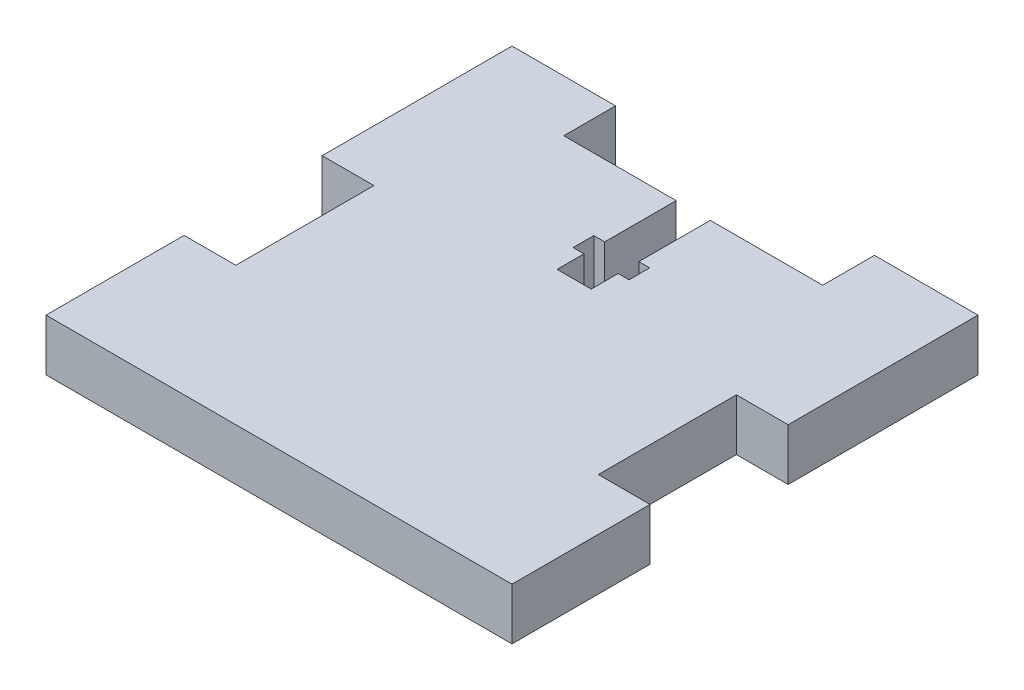
ISO-10303-21;
HEADER;
FILE_DESCRIPTION(('STEP AP214'),'2;1');
FILE_NAME('part.step','',(''),(''),'','','');
FILE_SCHEMA(('AUTOMOTIVE_DESIGN { 1 0 10303 214 1 1 1 1 }'));
ENDSEC;
DATA;
#1=APPLICATION_CONTEXT('core data for automotive mechanical design processes');
#2=APPLICATION_PROTOCOL_DEFINITION('international standard','automotive_design',2000,#1);
#3=PRODUCT_CONTEXT('',#1,'mechanical');
#4=PRODUCT('Part','Part','',(#3));
#5=PRODUCT_RELATED_PRODUCT_CATEGORY('part','',(#4));
#6=PRODUCT_DEFINITION_FORMATION('','',#4);
#7=PRODUCT_DEFINITION_CONTEXT('part definition',#1,'design');
#8=PRODUCT_DEFINITION('design','',#6,#7);
#9=PRODUCT_DEFINITION_SHAPE('','',#8);
#10=(LENGTH_UNIT() NAMED_UNIT(*) SI_UNIT(.MILLI.,.METRE.));
#11=(NAMED_UNIT(*) PLANE_ANGLE_UNIT() SI_UNIT($,.RADIAN.));
#12=(NAMED_UNIT(*) SI_UNIT($,.STERADIAN.) SOLID_ANGLE_UNIT());
#13=UNCERTAINTY_MEASURE_WITH_UNIT(LENGTH_MEASURE(1.E-05),#10,'distance_accuracy_value','');
#14=(GEOMETRIC_REPRESENTATION_CONTEXT(3) GLOBAL_UNCERTAINTY_ASSIGNED_CONTEXT((#13)) GLOBAL_UNIT_ASSIGNED_CONTEXT((#10,
#11,#12)) REPRESENTATION_CONTEXT('',''));
#15=CARTESIAN_POINT('',(0.,0.,0.));
#16=DIRECTION('',(0.,0.,1.));
#17=DIRECTION('',(1.,0.,0.));
#18=AXIS2_PLACEMENT_3D('',#15,#16,#17);
#19=CARTESIAN_POINT('',(0.,0.,0.));
#20=DIRECTION('',(0.,0.,1.));
#21=DIRECTION('',(1.,0.,0.));
#22=AXIS2_PLACEMENT_3D('',#19,#20,#21);
#23=PLANE('',#22);
#24=DIRECTION('',(1.,0.,0.));
#25=VECTOR('',#24,1.);
#26=CARTESIAN_POINT('',(-22.225,-20.6375,0.));
#27=LINE('',#26,#25);
#28=CARTESIAN_POINT('',(2.09549999999999,-20.6375,0.));
#29=VERTEX_POINT('',#28);
#30=CARTESIAN_POINT('',(15.875,-20.6375,0.));
#31=VERTEX_POINT('',#30);
#32=EDGE_CURVE('E373',#29,#31,#27,.T.);
#33=ORIENTED_EDGE('',*,*,#32,.F.);
#34=DIRECTION('',(0.,-1.,0.));
#35=VECTOR('',#34,1.);
#36=CARTESIAN_POINT('',(2.09549999999999,-14.28745,0.));
#37=LINE('',#36,#35);
#38=CARTESIAN_POINT('',(2.09549999999999,-14.2875,0.));
#39=VERTEX_POINT('',#38);
#40=EDGE_CURVE('E272',#39,#29,#37,.T.);
#41=ORIENTED_EDGE('',*,*,#40,.F.);
#42=DIRECTION('',(-1.,0.,0.));
#43=VECTOR('',#42,1.);
#44=CARTESIAN_POINT('',(-22.225,-14.2875,0.));
#45=LINE('',#44,#43);
#46=CARTESIAN_POINT('',(15.875,-14.2875,0.));
#47=VERTEX_POINT('',#46);
#48=EDGE_CURVE('E371',#47,#39,#45,.T.);
#49=ORIENTED_EDGE('',*,*,#48,.F.);
#50=DIRECTION('',(0.,1.,0.));
#51=VECTOR('',#50,1.);
#52=CARTESIAN_POINT('',(15.875,-20.6375,0.));
#53=LINE('',#52,#51);
#54=EDGE_CURVE('E322',#31,#47,#53,.T.);
#55=ORIENTED_EDGE('',*,*,#54,.F.);
#56=EDGE_LOOP('',(#33,#41,#49,#55));
#57=FACE_BOUND('',#56,.T.);
#58=ADVANCED_FACE('F35',(#57),#23,.F.);
#59=CARTESIAN_POINT('',(-2.09550000000001,-14.2875,0.));
#60=VERTEX_POINT('',#59);
#61=CARTESIAN_POINT('',(-15.875,-14.2875,0.));
#62=VERTEX_POINT('',#61);
#63=EDGE_CURVE('E39',#60,#62,#45,.T.);
#64=ORIENTED_EDGE('',*,*,#63,.F.);
#65=DIRECTION('',(0.,-1.,0.));
#66=VECTOR('',#65,1.);
#67=CARTESIAN_POINT('',(-2.09550000000001,-14.28745,0.));
#68=LINE('',#67,#66);
#69=CARTESIAN_POINT('',(-2.09550000000001,-20.6375,0.));
#70=VERTEX_POINT('',#69);
#71=EDGE_CURVE('E275',#60,#70,#68,.T.);
#72=ORIENTED_EDGE('',*,*,#71,.T.);
#73=CARTESIAN_POINT('',(-15.875,-20.6375,0.));
#74=VERTEX_POINT('',#73);
#75=EDGE_CURVE('E360',#74,#70,#27,.T.);
#76=ORIENTED_EDGE('',*,*,#75,.F.);
#77=DIRECTION('',(0.,-1.,0.));
#78=VECTOR('',#77,1.);
#79=CARTESIAN_POINT('',(-15.875,-20.6375,0.));
#80=LINE('',#79,#78);
#81=EDGE_CURVE('E340',#62,#74,#80,.T.);
#82=ORIENTED_EDGE('',*,*,#81,.F.);
#83=EDGE_LOOP('',(#64,#72,#76,#82));
#84=FACE_BOUND('',#83,.T.);
#85=ADVANCED_FACE('F498',(#84),#23,.F.);
#86=CARTESIAN_POINT('',(22.225,-14.2875,50.8));
#87=DIRECTION('',(-1.,0.,0.));
#88=DIRECTION('',(0.,0.,1.));
#89=AXIS2_PLACEMENT_3D('',#86,#87,#88);
#90=PLANE('',#89);
#91=DIRECTION('',(0.,-1.,0.));
#92=VECTOR('',#91,1.);
#93=CARTESIAN_POINT('',(22.225,-14.2875,16.9333333333333));
#94=LINE('',#93,#92);
#95=CARTESIAN_POINT('',(22.225,-14.2875,16.9333333333333));
#96=VERTEX_POINT('',#95);
#97=CARTESIAN_POINT('',(22.225,-20.6375,16.9333333333333));
#98=VERTEX_POINT('',#97);
#99=EDGE_CURVE('E406',#96,#98,#94,.T.);
#100=ORIENTED_EDGE('',*,*,#99,.F.);
#101=DIRECTION('',(0.,0.,-1.));
#102=VECTOR('',#101,1.);
#103=CARTESIAN_POINT('',(22.225,-14.2875,50.8));
#104=LINE('',#103,#102);
#105=CARTESIAN_POINT('',(22.225,-14.2875,33.8666666666667));
#106=VERTEX_POINT('',#105);
#107=EDGE_CURVE('E12',#106,#96,#104,.T.);
#108=ORIENTED_EDGE('',*,*,#107,.F.);
#109=DIRECTION('',(0.,1.,0.));
#110=VECTOR('',#109,1.);
#111=CARTESIAN_POINT('',(22.225,-14.2875,33.8666666666667));
#112=LINE('',#111,#110);
#113=CARTESIAN_POINT('',(22.225,-20.6375,33.8666666666667));
#114=VERTEX_POINT('',#113);
#115=EDGE_CURVE('E456',#114,#106,#112,.T.);
#116=ORIENTED_EDGE('',*,*,#115,.F.);
#117=DIRECTION('',(0.,0.,-1.));
#118=VECTOR('',#117,1.);
#119=CARTESIAN_POINT('',(22.225,-20.6375,50.8));
#120=LINE('',#119,#118);
#121=EDGE_CURVE('E381',#114,#98,#120,.T.);
#122=ORIENTED_EDGE('',*,*,#121,.T.);
#123=EDGE_LOOP('',(#100,#108,#116,#122));
#124=FACE_BOUND('',#123,.T.);
#125=ADVANCED_FACE('F37',(#124),#90,.F.);
#126=CARTESIAN_POINT('',(-22.225,-14.2875,50.8));
#127=DIRECTION('',(1.,0.,0.));
#128=DIRECTION('',(0.,0.,-1.));
#129=AXIS2_PLACEMENT_3D('',#126,#127,#128);
#130=PLANE('',#129);
#131=DIRECTION('',(0.,1.,0.));
#132=VECTOR('',#131,1.);
#133=CARTESIAN_POINT('',(-22.225,-14.2875,16.9333333333333));
#134=LINE('',#133,#132);
#135=CARTESIAN_POINT('',(-22.225,-20.6375,16.9333333333333));
#136=VERTEX_POINT('',#135);
#137=CARTESIAN_POINT('',(-22.225,-14.2875,16.9333333333333));
#138=VERTEX_POINT('',#137);
#139=EDGE_CURVE('E393',#136,#138,#134,.T.);
#140=ORIENTED_EDGE('',*,*,#139,.F.);
#141=DIRECTION('',(0.,0.,-1.));
#142=VECTOR('',#141,1.);
#143=CARTESIAN_POINT('',(-22.225,-20.6375,50.8));
#144=LINE('',#143,#142);
#145=CARTESIAN_POINT('',(-22.225,-20.6375,33.8666666666667));
#146=VERTEX_POINT('',#145);
#147=EDGE_CURVE('E384',#146,#136,#144,.T.);
#148=ORIENTED_EDGE('',*,*,#147,.F.);
#149=DIRECTION('',(0.,-1.,0.));
#150=VECTOR('',#149,1.);
#151=CARTESIAN_POINT('',(-22.225,-14.2875,33.8666666666667));
#152=LINE('',#151,#150);
#153=CARTESIAN_POINT('',(-22.225,-14.2875,33.8666666666667));
#154=VERTEX_POINT('',#153);
#155=EDGE_CURVE('E394',#154,#146,#152,.T.);
#156=ORIENTED_EDGE('',*,*,#155,.F.);
#157=DIRECTION('',(0.,0.,-1.));
#158=VECTOR('',#157,1.);
#159=CARTESIAN_POINT('',(-22.225,-14.2875,50.8));
#160=LINE('',#159,#158);
#161=EDGE_CURVE('E45',#154,#138,#160,.T.);
#162=ORIENTED_EDGE('',*,*,#161,.T.);
#163=EDGE_LOOP('',(#140,#148,#156,#162));
#164=FACE_BOUND('',#163,.T.);
#165=ADVANCED_FACE('F391',(#164),#130,.F.);
#166=CARTESIAN_POINT('',(-22.225,-14.2875,50.8));
#167=DIRECTION('',(0.,-1.,0.));
#168=DIRECTION('',(0.,0.,-1.));
#169=AXIS2_PLACEMENT_3D('',#166,#167,#168);
#170=PLANE('',#169);
#171=ORIENTED_EDGE('',*,*,#48,.T.);
#172=DIRECTION('',(0.,0.,1.));
#173=VECTOR('',#172,1.);
#174=CARTESIAN_POINT('',(2.09549999999998,-14.2875,50.8));
#175=LINE('',#174,#173);
#176=CARTESIAN_POINT('',(2.09549999999999,-14.2875,8.76299999999999));
#177=VERTEX_POINT('',#176);
#178=EDGE_CURVE('E319',#39,#177,#175,.T.);
#179=ORIENTED_EDGE('',*,*,#178,.T.);
#180=DIRECTION('',(1.,0.,0.));
#181=VECTOR('',#180,1.);
#182=CARTESIAN_POINT('',(-22.225,-14.2875,8.76299999999999));
#183=LINE('',#182,#181);
#184=CARTESIAN_POINT('',(3.42899999999999,-14.2875,8.76299999999999));
#185=VERTEX_POINT('',#184);
#186=EDGE_CURVE('E274',#177,#185,#183,.T.);
#187=ORIENTED_EDGE('',*,*,#186,.T.);
#188=DIRECTION('',(0.,0.,1.));
#189=VECTOR('',#188,1.);
#190=CARTESIAN_POINT('',(3.42899999999999,-14.2875,50.8));
#191=LINE('',#190,#189);
#192=CARTESIAN_POINT('',(3.42899999999999,-14.2875,11.303));
#193=VERTEX_POINT('',#192);
#194=EDGE_CURVE('E233',#185,#193,#191,.T.);
#195=ORIENTED_EDGE('',*,*,#194,.T.);
#196=DIRECTION('',(-1.,0.,0.));
#197=VECTOR('',#196,1.);
#198=CARTESIAN_POINT('',(-22.225,-14.2875,11.303));
#199=LINE('',#198,#197);
#200=CARTESIAN_POINT('',(2.09549999999999,-14.2875,11.303));
#201=VERTEX_POINT('',#200);
#202=EDGE_CURVE('E296',#193,#201,#199,.T.);
#203=ORIENTED_EDGE('',*,*,#202,.T.);
#204=DIRECTION('',(0.,0.,1.));
#205=VECTOR('',#204,1.);
#206=CARTESIAN_POINT('',(2.09549999999999,-14.2875,50.8));
#207=LINE('',#206,#205);
#208=CARTESIAN_POINT('',(2.09549999999999,-14.2875,14.605));
#209=VERTEX_POINT('',#208);
#210=EDGE_CURVE('E299',#201,#209,#207,.T.);
#211=ORIENTED_EDGE('',*,*,#210,.T.);
#212=DIRECTION('',(-1.,0.,0.));
#213=VECTOR('',#212,1.);
#214=CARTESIAN_POINT('',(-22.225,-14.2875,14.605));
#215=LINE('',#214,#213);
#216=CARTESIAN_POINT('',(-2.09550000000001,-14.2875,14.605));
#217=VERTEX_POINT('',#216);
#218=EDGE_CURVE('E302',#209,#217,#215,.T.);
#219=ORIENTED_EDGE('',*,*,#218,.T.);
#220=DIRECTION('',(0.,0.,-1.));
#221=VECTOR('',#220,1.);
#222=CARTESIAN_POINT('',(-2.09550000000002,-14.2875,50.8));
#223=LINE('',#222,#221);
#224=CARTESIAN_POINT('',(-2.09550000000001,-14.2875,11.303));
#225=VERTEX_POINT('',#224);
#226=EDGE_CURVE('E305',#217,#225,#223,.T.);
#227=ORIENTED_EDGE('',*,*,#226,.T.);
#228=DIRECTION('',(-1.,0.,0.));
#229=VECTOR('',#228,1.);
#230=CARTESIAN_POINT('',(-22.225,-14.2875,11.303));
#231=LINE('',#230,#229);
#232=CARTESIAN_POINT('',(-3.42900000000001,-14.2875,11.303));
#233=VERTEX_POINT('',#232);
#234=EDGE_CURVE('E308',#225,#233,#231,.T.);
#235=ORIENTED_EDGE('',*,*,#234,.T.);
#236=DIRECTION('',(0.,0.,-1.));
#237=VECTOR('',#236,1.);
#238=CARTESIAN_POINT('',(-3.42900000000001,-14.2875,50.8));
#239=LINE('',#238,#237);
#240=CARTESIAN_POINT('',(-3.42900000000001,-14.2875,8.76299999999999));
#241=VERTEX_POINT('',#240);
#242=EDGE_CURVE('E311',#233,#241,#239,.T.);
#243=ORIENTED_EDGE('',*,*,#242,.T.);
#244=DIRECTION('',(1.,0.,0.));
#245=VECTOR('',#244,1.);
#246=CARTESIAN_POINT('',(-22.225,-14.2875,8.76299999999999));
#247=LINE('',#246,#245);
#248=CARTESIAN_POINT('',(-2.09550000000001,-14.2875,8.76299999999999));
#249=VERTEX_POINT('',#248);
#250=EDGE_CURVE('E314',#241,#249,#247,.T.);
#251=ORIENTED_EDGE('',*,*,#250,.T.);
#252=DIRECTION('',(0.,0.,-1.));
#253=VECTOR('',#252,1.);
#254=CARTESIAN_POINT('',(-2.09550000000001,-14.2875,50.8));
#255=LINE('',#254,#253);
#256=EDGE_CURVE('E317',#249,#60,#255,.T.);
#257=ORIENTED_EDGE('',*,*,#256,.T.);
#258=ORIENTED_EDGE('',*,*,#63,.T.);
#259=DIRECTION('',(0.,0.,1.));
#260=VECTOR('',#259,1.);
#261=CARTESIAN_POINT('',(-15.875,-14.2875,-6.35));
#262=LINE('',#261,#260);
#263=CARTESIAN_POINT('',(-15.875,-14.2875,-6.35));
#264=VERTEX_POINT('',#263);
#265=EDGE_CURVE('E364',#264,#62,#262,.T.);
#266=ORIENTED_EDGE('',*,*,#265,.F.);
#267=DIRECTION('',(1.,0.,0.));
#268=VECTOR('',#267,1.);
#269=CARTESIAN_POINT('',(-28.575,-14.2875,-6.35));
#270=LINE('',#269,#268);
#271=CARTESIAN_POINT('',(-28.575,-14.2875,-6.35));
#272=VERTEX_POINT('',#271);
#273=EDGE_CURVE('E344',#272,#264,#270,.T.);
#274=ORIENTED_EDGE('',*,*,#273,.F.);
#275=DIRECTION('',(0.,0.,1.));
#276=VECTOR('',#275,1.);
#277=CARTESIAN_POINT('',(-28.575,-14.2875,0.));
#278=LINE('',#277,#276);
#279=CARTESIAN_POINT('',(-28.575,-14.2875,16.9333333333333));
#280=VERTEX_POINT('',#279);
#281=EDGE_CURVE('E411',#272,#280,#278,.T.);
#282=ORIENTED_EDGE('',*,*,#281,.T.);
#283=DIRECTION('',(1.,0.,0.));
#284=VECTOR('',#283,1.);
#285=CARTESIAN_POINT('',(-46.6598079275888,-14.2875,16.9333333333333));
#286=LINE('',#285,#284);
#287=EDGE_CURVE('E402',#280,#138,#286,.T.);
#288=ORIENTED_EDGE('',*,*,#287,.T.);
#289=ORIENTED_EDGE('',*,*,#161,.F.);
#290=DIRECTION('',(1.,0.,0.));
#291=VECTOR('',#290,1.);
#292=CARTESIAN_POINT('',(-46.6598079275888,-14.2875,33.8666666666667));
#293=LINE('',#292,#291);
#294=CARTESIAN_POINT('',(-28.575,-14.2875,33.8666666666667));
#295=VERTEX_POINT('',#294);
#296=EDGE_CURVE('E451',#295,#154,#293,.T.);
#297=ORIENTED_EDGE('',*,*,#296,.F.);
#298=DIRECTION('',(0.,0.,1.));
#299=VECTOR('',#298,1.);
#300=CARTESIAN_POINT('',(-28.575,-14.2875,50.8));
#301=LINE('',#300,#299);
#302=CARTESIAN_POINT('',(-28.575,-14.2875,50.8));
#303=VERTEX_POINT('',#302);
#304=EDGE_CURVE('E440',#295,#303,#301,.T.);
#305=ORIENTED_EDGE('',*,*,#304,.T.);
#306=DIRECTION('',(-1.,0.,0.));
#307=VECTOR('',#306,1.);
#308=CARTESIAN_POINT('',(-22.225,-14.2875,50.8));
#309=LINE('',#308,#307);
#310=CARTESIAN_POINT('',(28.575,-14.2875,50.8));
#311=VERTEX_POINT('',#310);
#312=EDGE_CURVE('E457',#311,#303,#309,.T.);
#313=ORIENTED_EDGE('',*,*,#312,.F.);
#314=DIRECTION('',(0.,0.,1.));
#315=VECTOR('',#314,1.);
#316=CARTESIAN_POINT('',(28.575,-14.2875,50.8));
#317=LINE('',#316,#315);
#318=CARTESIAN_POINT('',(28.575,-14.2875,33.8666666666667));
#319=VERTEX_POINT('',#318);
#320=EDGE_CURVE('E433',#319,#311,#317,.T.);
#321=ORIENTED_EDGE('',*,*,#320,.F.);
#322=EDGE_CURVE('E450',#106,#319,#293,.T.);
#323=ORIENTED_EDGE('',*,*,#322,.F.);
#324=ORIENTED_EDGE('',*,*,#107,.T.);
#325=CARTESIAN_POINT('',(28.575,-14.2875,16.9333333333333));
#326=VERTEX_POINT('',#325);
#327=EDGE_CURVE('E413',#96,#326,#286,.T.);
#328=ORIENTED_EDGE('',*,*,#327,.T.);
#329=DIRECTION('',(0.,0.,1.));
#330=VECTOR('',#329,1.);
#331=CARTESIAN_POINT('',(28.575,-14.2875,0.));
#332=LINE('',#331,#330);
#333=CARTESIAN_POINT('',(28.575,-14.2875,-6.35));
#334=VERTEX_POINT('',#333);
#335=EDGE_CURVE('E476',#334,#326,#332,.T.);
#336=ORIENTED_EDGE('',*,*,#335,.F.);
#337=DIRECTION('',(1.,0.,0.));
#338=VECTOR('',#337,1.);
#339=CARTESIAN_POINT('',(28.575,-14.2875,-6.35));
#340=LINE('',#339,#338);
#341=CARTESIAN_POINT('',(15.875,-14.2875,-6.35));
#342=VERTEX_POINT('',#341);
#343=EDGE_CURVE('E330',#342,#334,#340,.T.);
#344=ORIENTED_EDGE('',*,*,#343,.F.);
#345=DIRECTION('',(0.,0.,1.));
#346=VECTOR('',#345,1.);
#347=CARTESIAN_POINT('',(15.875,-14.2875,-6.35));
#348=LINE('',#347,#346);
#349=EDGE_CURVE('E333',#342,#47,#348,.T.);
#350=ORIENTED_EDGE('',*,*,#349,.T.);
#351=EDGE_LOOP('',(#171,#179,#187,#195,#203,#211,#219,#227,#235,#243,#251,#257,#258,#266,#274,
#282,#288,#289,#297,#305,#313,#321,#323,#324,#328,#336,#344,#350));
#352=FACE_BOUND('',#351,.T.);
#353=ADVANCED_FACE('F409',(#352),#170,.F.);
#354=CARTESIAN_POINT('',(-22.225,-20.6375,50.8));
#355=DIRECTION('',(0.,1.,0.));
#356=DIRECTION('',(0.,0.,1.));
#357=AXIS2_PLACEMENT_3D('',#354,#355,#356);
#358=PLANE('',#357);
#359=DIRECTION('',(1.,0.,0.));
#360=VECTOR('',#359,1.);
#361=CARTESIAN_POINT('',(3.42899999999999,-20.6375,8.76299999999999));
#362=LINE('',#361,#360);
#363=CARTESIAN_POINT('',(2.09549999999999,-20.6375,8.76299999999999));
#364=VERTEX_POINT('',#363);
#365=CARTESIAN_POINT('',(3.42899999999999,-20.6375,8.76299999999999));
#366=VERTEX_POINT('',#365);
#367=EDGE_CURVE('E240',#364,#366,#362,.T.);
#368=ORIENTED_EDGE('',*,*,#367,.F.);
#369=DIRECTION('',(0.,0.,1.));
#370=VECTOR('',#369,1.);
#371=CARTESIAN_POINT('',(2.09549999999999,-20.6375,8.76299999999999));
#372=LINE('',#371,#370);
#373=EDGE_CURVE('E53',#29,#364,#372,.T.);
#374=ORIENTED_EDGE('',*,*,#373,.F.);
#375=ORIENTED_EDGE('',*,*,#32,.T.);
#376=DIRECTION('',(0.,0.,1.));
#377=VECTOR('',#376,1.);
#378=CARTESIAN_POINT('',(15.875,-20.6375,-6.35));
#379=LINE('',#378,#377);
#380=CARTESIAN_POINT('',(15.875,-20.6375,-6.35));
#381=VERTEX_POINT('',#380);
#382=EDGE_CURVE('E337',#381,#31,#379,.T.);
#383=ORIENTED_EDGE('',*,*,#382,.F.);
#384=DIRECTION('',(-1.,0.,0.));
#385=VECTOR('',#384,1.);
#386=CARTESIAN_POINT('',(28.575,-20.6375,-6.35));
#387=LINE('',#386,#385);
#388=CARTESIAN_POINT('',(28.575,-20.6375,-6.35));
#389=VERTEX_POINT('',#388);
#390=EDGE_CURVE('E326',#389,#381,#387,.T.);
#391=ORIENTED_EDGE('',*,*,#390,.F.);
#392=DIRECTION('',(0.,0.,-1.));
#393=VECTOR('',#392,1.);
#394=CARTESIAN_POINT('',(28.575,-20.6375,0.));
#395=LINE('',#394,#393);
#396=CARTESIAN_POINT('',(28.575,-20.6375,16.9333333333333));
#397=VERTEX_POINT('',#396);
#398=EDGE_CURVE('E416',#397,#389,#395,.T.);
#399=ORIENTED_EDGE('',*,*,#398,.F.);
#400=DIRECTION('',(1.,0.,0.));
#401=VECTOR('',#400,1.);
#402=CARTESIAN_POINT('',(-46.6598079275888,-20.6375,16.9333333333333));
#403=LINE('',#402,#401);
#404=EDGE_CURVE('E412',#98,#397,#403,.T.);
#405=ORIENTED_EDGE('',*,*,#404,.F.);
#406=ORIENTED_EDGE('',*,*,#121,.F.);
#407=DIRECTION('',(1.,0.,0.));
#408=VECTOR('',#407,1.);
#409=CARTESIAN_POINT('',(-46.6598079275888,-20.6375,33.8666666666667));
#410=LINE('',#409,#408);
#411=CARTESIAN_POINT('',(28.575,-20.6375,33.8666666666667));
#412=VERTEX_POINT('',#411);
#413=EDGE_CURVE('E436',#114,#412,#410,.T.);
#414=ORIENTED_EDGE('',*,*,#413,.T.);
#415=DIRECTION('',(0.,0.,-1.));
#416=VECTOR('',#415,1.);
#417=CARTESIAN_POINT('',(28.575,-20.6375,50.8));
#418=LINE('',#417,#416);
#419=CARTESIAN_POINT('',(28.575,-20.6375,50.8));
#420=VERTEX_POINT('',#419);
#421=EDGE_CURVE('E427',#420,#412,#418,.T.);
#422=ORIENTED_EDGE('',*,*,#421,.F.);
#423=DIRECTION('',(1.,0.,0.));
#424=VECTOR('',#423,1.);
#425=CARTESIAN_POINT('',(-22.225,-20.6375,50.8));
#426=LINE('',#425,#424);
#427=CARTESIAN_POINT('',(-28.575,-20.6375,50.8));
#428=VERTEX_POINT('',#427);
#429=EDGE_CURVE('E376',#428,#420,#426,.T.);
#430=ORIENTED_EDGE('',*,*,#429,.F.);
#431=DIRECTION('',(0.,0.,-1.));
#432=VECTOR('',#431,1.);
#433=CARTESIAN_POINT('',(-28.575,-20.6375,50.8));
#434=LINE('',#433,#432);
#435=CARTESIAN_POINT('',(-28.575,-20.6375,33.8666666666667));
#436=VERTEX_POINT('',#435);
#437=EDGE_CURVE('E441',#428,#436,#434,.T.);
#438=ORIENTED_EDGE('',*,*,#437,.T.);
#439=EDGE_CURVE('E447',#436,#146,#410,.T.);
#440=ORIENTED_EDGE('',*,*,#439,.T.);
#441=ORIENTED_EDGE('',*,*,#147,.T.);
#442=CARTESIAN_POINT('',(-28.575,-20.6375,16.9333333333333));
#443=VERTEX_POINT('',#442);
#444=EDGE_CURVE('E405',#443,#136,#403,.T.);
#445=ORIENTED_EDGE('',*,*,#444,.F.);
#446=DIRECTION('',(0.,0.,-1.));
#447=VECTOR('',#446,1.);
#448=CARTESIAN_POINT('',(-28.575,-20.6375,0.));
#449=LINE('',#448,#447);
#450=CARTESIAN_POINT('',(-28.575,-20.6375,-6.35));
#451=VERTEX_POINT('',#450);
#452=EDGE_CURVE('E407',#443,#451,#449,.T.);
#453=ORIENTED_EDGE('',*,*,#452,.T.);
#454=DIRECTION('',(-1.,0.,0.));
#455=VECTOR('',#454,1.);
#456=CARTESIAN_POINT('',(-28.575,-20.6375,-6.35));
#457=LINE('',#456,#455);
#458=CARTESIAN_POINT('',(-15.875,-20.6375,-6.35));
#459=VERTEX_POINT('',#458);
#460=EDGE_CURVE('E348',#459,#451,#457,.T.);
#461=ORIENTED_EDGE('',*,*,#460,.F.);
#462=DIRECTION('',(0.,0.,1.));
#463=VECTOR('',#462,1.);
#464=CARTESIAN_POINT('',(-15.875,-20.6375,-6.35));
#465=LINE('',#464,#463);
#466=EDGE_CURVE('E351',#459,#74,#465,.T.);
#467=ORIENTED_EDGE('',*,*,#466,.T.);
#468=ORIENTED_EDGE('',*,*,#75,.T.);
#469=DIRECTION('',(0.,0.,-1.));
#470=VECTOR('',#469,1.);
#471=CARTESIAN_POINT('',(-2.09550000000001,-20.6375,8.76299999999999));
#472=LINE('',#471,#470);
#473=CARTESIAN_POINT('',(-2.09550000000001,-20.6375,8.76299999999999));
#474=VERTEX_POINT('',#473);
#475=EDGE_CURVE('E270',#474,#70,#472,.T.);
#476=ORIENTED_EDGE('',*,*,#475,.F.);
#477=DIRECTION('',(1.,0.,0.));
#478=VECTOR('',#477,1.);
#479=CARTESIAN_POINT('',(-3.42900000000001,-20.6375,8.76299999999999));
#480=LINE('',#479,#478);
#481=CARTESIAN_POINT('',(-3.42900000000001,-20.6375,8.76299999999999));
#482=VERTEX_POINT('',#481);
#483=EDGE_CURVE('E267',#482,#474,#480,.T.);
#484=ORIENTED_EDGE('',*,*,#483,.F.);
#485=DIRECTION('',(0.,0.,-1.));
#486=VECTOR('',#485,1.);
#487=CARTESIAN_POINT('',(-3.42900000000001,-20.6375,11.303));
#488=LINE('',#487,#486);
#489=CARTESIAN_POINT('',(-3.42900000000001,-20.6375,11.303));
#490=VERTEX_POINT('',#489);
#491=EDGE_CURVE('E264',#490,#482,#488,.T.);
#492=ORIENTED_EDGE('',*,*,#491,.F.);
#493=DIRECTION('',(-1.,0.,0.));
#494=VECTOR('',#493,1.);
#495=CARTESIAN_POINT('',(-2.09550000000001,-20.6375,11.303));
#496=LINE('',#495,#494);
#497=CARTESIAN_POINT('',(-2.09550000000001,-20.6375,11.303));
#498=VERTEX_POINT('',#497);
#499=EDGE_CURVE('E261',#498,#490,#496,.T.);
#500=ORIENTED_EDGE('',*,*,#499,.F.);
#501=DIRECTION('',(0.,0.,-1.));
#502=VECTOR('',#501,1.);
#503=CARTESIAN_POINT('',(-2.09550000000001,-20.6375,11.303));
#504=LINE('',#503,#502);
#505=CARTESIAN_POINT('',(-2.09550000000001,-20.6375,14.605));
#506=VERTEX_POINT('',#505);
#507=EDGE_CURVE('E258',#506,#498,#504,.T.);
#508=ORIENTED_EDGE('',*,*,#507,.F.);
#509=DIRECTION('',(-1.,0.,0.));
#510=VECTOR('',#509,1.);
#511=CARTESIAN_POINT('',(2.09549999999999,-20.6375,14.605));
#512=LINE('',#511,#510);
#513=CARTESIAN_POINT('',(2.09549999999999,-20.6375,14.605));
#514=VERTEX_POINT('',#513);
#515=EDGE_CURVE('E255',#514,#506,#512,.T.);
#516=ORIENTED_EDGE('',*,*,#515,.F.);
#517=DIRECTION('',(0.,0.,1.));
#518=VECTOR('',#517,1.);
#519=CARTESIAN_POINT('',(2.09549999999999,-20.6375,11.303));
#520=LINE('',#519,#518);
#521=CARTESIAN_POINT('',(2.09549999999999,-20.6375,11.303));
#522=VERTEX_POINT('',#521);
#523=EDGE_CURVE('E249',#522,#514,#520,.T.);
#524=ORIENTED_EDGE('',*,*,#523,.F.);
#525=DIRECTION('',(-1.,0.,0.));
#526=VECTOR('',#525,1.);
#527=CARTESIAN_POINT('',(2.09549999999999,-20.6375,11.303));
#528=LINE('',#527,#526);
#529=CARTESIAN_POINT('',(3.42899999999999,-20.6375,11.303));
#530=VERTEX_POINT('',#529);
#531=EDGE_CURVE('E247',#530,#522,#528,.T.);
#532=ORIENTED_EDGE('',*,*,#531,.F.);
#533=DIRECTION('',(0.,0.,1.));
#534=VECTOR('',#533,1.);
#535=CARTESIAN_POINT('',(3.42899999999999,-20.6375,11.303));
#536=LINE('',#535,#534);
#537=EDGE_CURVE('E230',#366,#530,#536,.T.);
#538=ORIENTED_EDGE('',*,*,#537,.F.);
#539=EDGE_LOOP('',(#368,#374,#375,#383,#391,#399,#405,#406,#414,#422,#430,#438,#440,#441,#445,
#453,#461,#467,#468,#476,#484,#492,#500,#508,#516,#524,#532,#538));
#540=FACE_BOUND('',#539,.T.);
#541=ADVANCED_FACE('F244',(#540),#358,.F.);
#542=CARTESIAN_POINT('',(0.,0.,50.8));
#543=DIRECTION('',(0.,0.,1.));
#544=DIRECTION('',(1.,0.,0.));
#545=AXIS2_PLACEMENT_3D('',#542,#543,#544);
#546=PLANE('',#545);
#547=ORIENTED_EDGE('',*,*,#429,.T.);
#548=DIRECTION('',(0.,-1.,0.));
#549=VECTOR('',#548,1.);
#550=CARTESIAN_POINT('',(28.575,-20.6375,50.8));
#551=LINE('',#550,#549);
#552=EDGE_CURVE('E430',#311,#420,#551,.T.);
#553=ORIENTED_EDGE('',*,*,#552,.F.);
#554=ORIENTED_EDGE('',*,*,#312,.T.);
#555=DIRECTION('',(0.,-1.,0.));
#556=VECTOR('',#555,1.);
#557=CARTESIAN_POINT('',(-28.575,-20.6375,50.8));
#558=LINE('',#557,#556);
#559=EDGE_CURVE('E444',#303,#428,#558,.T.);
#560=ORIENTED_EDGE('',*,*,#559,.T.);
#561=EDGE_LOOP('',(#547,#553,#554,#560));
#562=FACE_BOUND('',#561,.T.);
#563=ADVANCED_FACE('F544',(#562),#546,.T.);
#564=CARTESIAN_POINT('',(-28.575,14.2875,80.0720536519049));
#565=DIRECTION('',(1.,0.,0.));
#566=DIRECTION('',(0.,1.,0.));
#567=AXIS2_PLACEMENT_3D('',#564,#565,#566);
#568=PLANE('',#567);
#569=ORIENTED_EDGE('',*,*,#304,.F.);
#570=DIRECTION('',(0.,1.,0.));
#571=VECTOR('',#570,1.);
#572=CARTESIAN_POINT('',(-28.575,-20.6375,33.8666666666667));
#573=LINE('',#572,#571);
#574=EDGE_CURVE('E437',#436,#295,#573,.T.);
#575=ORIENTED_EDGE('',*,*,#574,.F.);
#576=ORIENTED_EDGE('',*,*,#437,.F.);
#577=ORIENTED_EDGE('',*,*,#559,.F.);
#578=EDGE_LOOP('',(#569,#575,#576,#577));
#579=FACE_BOUND('',#578,.T.);
#580=ADVANCED_FACE('F566',(#579),#568,.F.);
#581=CARTESIAN_POINT('',(-46.6598079275888,-20.6375,33.8666666666667));
#582=DIRECTION('',(0.,0.,1.));
#583=DIRECTION('',(1.,0.,0.));
#584=AXIS2_PLACEMENT_3D('',#581,#582,#583);
#585=PLANE('',#584);
#586=ORIENTED_EDGE('',*,*,#296,.T.);
#587=ORIENTED_EDGE('',*,*,#155,.T.);
#588=ORIENTED_EDGE('',*,*,#439,.F.);
#589=ORIENTED_EDGE('',*,*,#574,.T.);
#590=EDGE_LOOP('',(#586,#587,#588,#589));
#591=FACE_BOUND('',#590,.T.);
#592=ADVANCED_FACE('F572',(#591),#585,.F.);
#593=ORIENTED_EDGE('',*,*,#413,.F.);
#594=ORIENTED_EDGE('',*,*,#115,.T.);
#595=ORIENTED_EDGE('',*,*,#322,.T.);
#596=DIRECTION('',(0.,1.,0.));
#597=VECTOR('',#596,1.);
#598=CARTESIAN_POINT('',(28.575,-20.6375,33.8666666666667));
#599=LINE('',#598,#597);
#600=EDGE_CURVE('E424',#412,#319,#599,.T.);
#601=ORIENTED_EDGE('',*,*,#600,.F.);
#602=EDGE_LOOP('',(#593,#594,#595,#601));
#603=FACE_BOUND('',#602,.T.);
#604=ADVANCED_FACE('F580',(#603),#585,.F.);
#605=CARTESIAN_POINT('',(28.575,-14.2875,50.8));
#606=DIRECTION('',(-1.,0.,0.));
#607=DIRECTION('',(0.,0.,1.));
#608=AXIS2_PLACEMENT_3D('',#605,#606,#607);
#609=PLANE('',#608);
#610=ORIENTED_EDGE('',*,*,#552,.T.);
#611=ORIENTED_EDGE('',*,*,#421,.T.);
#612=ORIENTED_EDGE('',*,*,#600,.T.);
#613=ORIENTED_EDGE('',*,*,#320,.T.);
#614=EDGE_LOOP('',(#610,#611,#612,#613));
#615=FACE_BOUND('',#614,.T.);
#616=ADVANCED_FACE('F587',(#615),#609,.F.);
#617=CARTESIAN_POINT('',(-28.575,14.2875,80.0720536519049));
#618=DIRECTION('',(1.,0.,0.));
#619=DIRECTION('',(0.,1.,0.));
#620=AXIS2_PLACEMENT_3D('',#617,#618,#619);
#621=PLANE('',#620);
#622=ORIENTED_EDGE('',*,*,#452,.F.);
#623=DIRECTION('',(0.,-1.,0.));
#624=VECTOR('',#623,1.);
#625=CARTESIAN_POINT('',(-28.575,-20.6375,16.9333333333333));
#626=LINE('',#625,#624);
#627=EDGE_CURVE('E420',#280,#443,#626,.T.);
#628=ORIENTED_EDGE('',*,*,#627,.F.);
#629=ORIENTED_EDGE('',*,*,#281,.F.);
#630=DIRECTION('',(0.,1.,0.));
#631=VECTOR('',#630,1.);
#632=CARTESIAN_POINT('',(-28.575,-20.6375,-6.35));
#633=LINE('',#632,#631);
#634=EDGE_CURVE('E341',#451,#272,#633,.T.);
#635=ORIENTED_EDGE('',*,*,#634,.F.);
#636=EDGE_LOOP('',(#622,#628,#629,#635));
#637=FACE_BOUND('',#636,.T.);
#638=ADVANCED_FACE('F494',(#637),#621,.F.);
#639=CARTESIAN_POINT('',(-46.6598079275888,-20.6375,16.9333333333333));
#640=DIRECTION('',(0.,0.,-1.));
#641=DIRECTION('',(0.,1.,0.));
#642=AXIS2_PLACEMENT_3D('',#639,#640,#641);
#643=PLANE('',#642);
#644=ORIENTED_EDGE('',*,*,#444,.T.);
#645=ORIENTED_EDGE('',*,*,#139,.T.);
#646=ORIENTED_EDGE('',*,*,#287,.F.);
#647=ORIENTED_EDGE('',*,*,#627,.T.);
#648=EDGE_LOOP('',(#644,#645,#646,#647));
#649=FACE_BOUND('',#648,.T.);
#650=ADVANCED_FACE('F400',(#649),#643,.F.);
#651=ORIENTED_EDGE('',*,*,#327,.F.);
#652=ORIENTED_EDGE('',*,*,#99,.T.);
#653=ORIENTED_EDGE('',*,*,#404,.T.);
#654=DIRECTION('',(0.,-1.,0.));
#655=VECTOR('',#654,1.);
#656=CARTESIAN_POINT('',(28.575,-20.6375,16.9333333333333));
#657=LINE('',#656,#655);
#658=EDGE_CURVE('E354',#326,#397,#657,.T.);
#659=ORIENTED_EDGE('',*,*,#658,.F.);
#660=EDGE_LOOP('',(#651,#652,#653,#659));
#661=FACE_BOUND('',#660,.T.);
#662=ADVANCED_FACE('F609',(#661),#643,.F.);
#663=CARTESIAN_POINT('',(28.575,-14.2875,50.8));
#664=DIRECTION('',(-1.,0.,0.));
#665=DIRECTION('',(0.,0.,1.));
#666=AXIS2_PLACEMENT_3D('',#663,#664,#665);
#667=PLANE('',#666);
#668=ORIENTED_EDGE('',*,*,#398,.T.);
#669=DIRECTION('',(0.,-1.,0.));
#670=VECTOR('',#669,1.);
#671=CARTESIAN_POINT('',(28.575,-20.6375,-6.35));
#672=LINE('',#671,#670);
#673=EDGE_CURVE('E323',#334,#389,#672,.T.);
#674=ORIENTED_EDGE('',*,*,#673,.F.);
#675=ORIENTED_EDGE('',*,*,#335,.T.);
#676=ORIENTED_EDGE('',*,*,#658,.T.);
#677=EDGE_LOOP('',(#668,#674,#675,#676));
#678=FACE_BOUND('',#677,.T.);
#679=ADVANCED_FACE('F481',(#678),#667,.F.);
#680=CARTESIAN_POINT('',(-15.875,-20.6375,-6.35));
#681=DIRECTION('',(-1.,0.,0.));
#682=DIRECTION('',(0.,-1.,0.));
#683=AXIS2_PLACEMENT_3D('',#680,#681,#682);
#684=PLANE('',#683);
#685=ORIENTED_EDGE('',*,*,#81,.T.);
#686=ORIENTED_EDGE('',*,*,#466,.F.);
#687=DIRECTION('',(0.,-1.,0.));
#688=VECTOR('',#687,1.);
#689=CARTESIAN_POINT('',(-15.875,-20.6375,-6.35));
#690=LINE('',#689,#688);
#691=EDGE_CURVE('E346',#264,#459,#690,.T.);
#692=ORIENTED_EDGE('',*,*,#691,.F.);
#693=ORIENTED_EDGE('',*,*,#265,.T.);
#694=EDGE_LOOP('',(#685,#686,#692,#693));
#695=FACE_BOUND('',#694,.T.);
#696=ADVANCED_FACE('F496',(#695),#684,.F.);
#697=CARTESIAN_POINT('',(0.,0.,-6.35));
#698=DIRECTION('',(0.,0.,-1.));
#699=DIRECTION('',(-1.,0.,0.));
#700=AXIS2_PLACEMENT_3D('',#697,#698,#699);
#701=PLANE('',#700);
#702=ORIENTED_EDGE('',*,*,#634,.T.);
#703=ORIENTED_EDGE('',*,*,#273,.T.);
#704=ORIENTED_EDGE('',*,*,#691,.T.);
#705=ORIENTED_EDGE('',*,*,#460,.T.);
#706=EDGE_LOOP('',(#702,#703,#704,#705));
#707=FACE_BOUND('',#706,.T.);
#708=ADVANCED_FACE('F491',(#707),#701,.T.);
#709=CARTESIAN_POINT('',(15.875,-20.6375,-6.35));
#710=DIRECTION('',(1.,0.,0.));
#711=DIRECTION('',(0.,0.,-1.));
#712=AXIS2_PLACEMENT_3D('',#709,#710,#711);
#713=PLANE('',#712);
#714=ORIENTED_EDGE('',*,*,#54,.T.);
#715=ORIENTED_EDGE('',*,*,#349,.F.);
#716=DIRECTION('',(0.,1.,0.));
#717=VECTOR('',#716,1.);
#718=CARTESIAN_POINT('',(15.875,-20.6375,-6.35));
#719=LINE('',#718,#717);
#720=EDGE_CURVE('E328',#381,#342,#719,.T.);
#721=ORIENTED_EDGE('',*,*,#720,.F.);
#722=ORIENTED_EDGE('',*,*,#382,.T.);
#723=EDGE_LOOP('',(#714,#715,#721,#722));
#724=FACE_BOUND('',#723,.T.);
#725=ADVANCED_FACE('F471',(#724),#713,.F.);
#726=CARTESIAN_POINT('',(0.,0.,-6.35));
#727=DIRECTION('',(0.,0.,1.));
#728=DIRECTION('',(1.,0.,0.));
#729=AXIS2_PLACEMENT_3D('',#726,#727,#728);
#730=PLANE('',#729);
#731=ORIENTED_EDGE('',*,*,#673,.T.);
#732=ORIENTED_EDGE('',*,*,#390,.T.);
#733=ORIENTED_EDGE('',*,*,#720,.T.);
#734=ORIENTED_EDGE('',*,*,#343,.T.);
#735=EDGE_LOOP('',(#731,#732,#733,#734));
#736=FACE_BOUND('',#735,.T.);
#737=ADVANCED_FACE('F479',(#736),#730,.F.);
#738=CARTESIAN_POINT('',(2.09549999999999,-14.28745,8.76299999999999));
#739=DIRECTION('',(1.,0.,0.));
#740=DIRECTION('',(0.,0.,-1.));
#741=AXIS2_PLACEMENT_3D('',#738,#739,#740);
#742=PLANE('',#741);
#743=ORIENTED_EDGE('',*,*,#40,.T.);
#744=ORIENTED_EDGE('',*,*,#373,.T.);
#745=DIRECTION('',(0.,-1.,0.));
#746=VECTOR('',#745,1.);
#747=CARTESIAN_POINT('',(2.09549999999999,-14.28745,8.76299999999999));
#748=LINE('',#747,#746);
#749=EDGE_CURVE('E237',#177,#364,#748,.T.);
#750=ORIENTED_EDGE('',*,*,#749,.F.);
#751=ORIENTED_EDGE('',*,*,#178,.F.);
#752=EDGE_LOOP('',(#743,#744,#750,#751));
#753=FACE_BOUND('',#752,.T.);
#754=ADVANCED_FACE('F527',(#753),#742,.F.);
#755=CARTESIAN_POINT('',(-2.09550000000001,-14.28745,8.76299999999999));
#756=DIRECTION('',(-1.,0.,0.));
#757=DIRECTION('',(0.,0.,1.));
#758=AXIS2_PLACEMENT_3D('',#755,#756,#757);
#759=PLANE('',#758);
#760=DIRECTION('',(0.,-1.,0.));
#761=VECTOR('',#760,1.);
#762=CARTESIAN_POINT('',(-2.09550000000001,-14.28745,8.76299999999999));
#763=LINE('',#762,#761);
#764=EDGE_CURVE('E278',#249,#474,#763,.T.);
#765=ORIENTED_EDGE('',*,*,#764,.T.);
#766=ORIENTED_EDGE('',*,*,#475,.T.);
#767=ORIENTED_EDGE('',*,*,#71,.F.);
#768=ORIENTED_EDGE('',*,*,#256,.F.);
#769=EDGE_LOOP('',(#765,#766,#767,#768));
#770=FACE_BOUND('',#769,.T.);
#771=ADVANCED_FACE('F500',(#770),#759,.F.);
#772=CARTESIAN_POINT('',(-3.42900000000001,-14.28745,8.76299999999999));
#773=DIRECTION('',(0.,0.,-1.));
#774=DIRECTION('',(-1.,0.,0.));
#775=AXIS2_PLACEMENT_3D('',#772,#773,#774);
#776=PLANE('',#775);
#777=DIRECTION('',(0.,-1.,0.));
#778=VECTOR('',#777,1.);
#779=CARTESIAN_POINT('',(-3.42900000000001,-14.28745,8.76299999999999));
#780=LINE('',#779,#778);
#781=EDGE_CURVE('E280',#241,#482,#780,.T.);
#782=ORIENTED_EDGE('',*,*,#781,.T.);
#783=ORIENTED_EDGE('',*,*,#483,.T.);
#784=ORIENTED_EDGE('',*,*,#764,.F.);
#785=ORIENTED_EDGE('',*,*,#250,.F.);
#786=EDGE_LOOP('',(#782,#783,#784,#785));
#787=FACE_BOUND('',#786,.T.);
#788=ADVANCED_FACE('F504',(#787),#776,.F.);
#789=CARTESIAN_POINT('',(-3.42900000000001,-14.28745,11.303));
#790=DIRECTION('',(-1.,0.,0.));
#791=DIRECTION('',(0.,0.,1.));
#792=AXIS2_PLACEMENT_3D('',#789,#790,#791);
#793=PLANE('',#792);
#794=DIRECTION('',(0.,-1.,0.));
#795=VECTOR('',#794,1.);
#796=CARTESIAN_POINT('',(-3.42900000000001,-14.28745,11.303));
#797=LINE('',#796,#795);
#798=EDGE_CURVE('E282',#233,#490,#797,.T.);
#799=ORIENTED_EDGE('',*,*,#798,.T.);
#800=ORIENTED_EDGE('',*,*,#491,.T.);
#801=ORIENTED_EDGE('',*,*,#781,.F.);
#802=ORIENTED_EDGE('',*,*,#242,.F.);
#803=EDGE_LOOP('',(#799,#800,#801,#802));
#804=FACE_BOUND('',#803,.T.);
#805=ADVANCED_FACE('F506',(#804),#793,.F.);
#806=CARTESIAN_POINT('',(-2.09550000000001,-14.28745,11.303));
#807=DIRECTION('',(0.,0.,1.));
#808=DIRECTION('',(1.,0.,0.));
#809=AXIS2_PLACEMENT_3D('',#806,#807,#808);
#810=PLANE('',#809);
#811=DIRECTION('',(0.,-1.,0.));
#812=VECTOR('',#811,1.);
#813=CARTESIAN_POINT('',(-2.09550000000001,-14.28745,11.303));
#814=LINE('',#813,#812);
#815=EDGE_CURVE('E284',#225,#498,#814,.T.);
#816=ORIENTED_EDGE('',*,*,#815,.T.);
#817=ORIENTED_EDGE('',*,*,#499,.T.);
#818=ORIENTED_EDGE('',*,*,#798,.F.);
#819=ORIENTED_EDGE('',*,*,#234,.F.);
#820=EDGE_LOOP('',(#816,#817,#818,#819));
#821=FACE_BOUND('',#820,.T.);
#822=ADVANCED_FACE('F514',(#821),#810,.F.);
#823=CARTESIAN_POINT('',(-2.09550000000001,-14.28745,11.303));
#824=DIRECTION('',(-1.,0.,0.));
#825=DIRECTION('',(0.,0.,1.));
#826=AXIS2_PLACEMENT_3D('',#823,#824,#825);
#827=PLANE('',#826);
#828=DIRECTION('',(0.,-1.,0.));
#829=VECTOR('',#828,1.);
#830=CARTESIAN_POINT('',(-2.09550000000001,-14.28745,14.605));
#831=LINE('',#830,#829);
#832=EDGE_CURVE('E286',#217,#506,#831,.T.);
#833=ORIENTED_EDGE('',*,*,#832,.T.);
#834=ORIENTED_EDGE('',*,*,#507,.T.);
#835=ORIENTED_EDGE('',*,*,#815,.F.);
#836=ORIENTED_EDGE('',*,*,#226,.F.);
#837=EDGE_LOOP('',(#833,#834,#835,#836));
#838=FACE_BOUND('',#837,.T.);
#839=ADVANCED_FACE('F517',(#838),#827,.F.);
#840=CARTESIAN_POINT('',(2.09549999999999,-14.28745,14.605));
#841=DIRECTION('',(0.,0.,1.));
#842=DIRECTION('',(1.,0.,0.));
#843=AXIS2_PLACEMENT_3D('',#840,#841,#842);
#844=PLANE('',#843);
#845=DIRECTION('',(0.,-1.,0.));
#846=VECTOR('',#845,1.);
#847=CARTESIAN_POINT('',(2.09549999999999,-14.28745,14.605));
#848=LINE('',#847,#846);
#849=EDGE_CURVE('E288',#209,#514,#848,.T.);
#850=ORIENTED_EDGE('',*,*,#849,.T.);
#851=ORIENTED_EDGE('',*,*,#515,.T.);
#852=ORIENTED_EDGE('',*,*,#832,.F.);
#853=ORIENTED_EDGE('',*,*,#218,.F.);
#854=EDGE_LOOP('',(#850,#851,#852,#853));
#855=FACE_BOUND('',#854,.T.);
#856=ADVANCED_FACE('F520',(#855),#844,.F.);
#857=CARTESIAN_POINT('',(2.09549999999999,-14.28745,11.303));
#858=DIRECTION('',(1.,0.,0.));
#859=DIRECTION('',(0.,0.,-1.));
#860=AXIS2_PLACEMENT_3D('',#857,#858,#859);
#861=PLANE('',#860);
#862=DIRECTION('',(0.,-1.,0.));
#863=VECTOR('',#862,1.);
#864=CARTESIAN_POINT('',(2.09549999999999,-14.28745,11.303));
#865=LINE('',#864,#863);
#866=EDGE_CURVE('E290',#201,#522,#865,.T.);
#867=ORIENTED_EDGE('',*,*,#866,.T.);
#868=ORIENTED_EDGE('',*,*,#523,.T.);
#869=ORIENTED_EDGE('',*,*,#849,.F.);
#870=ORIENTED_EDGE('',*,*,#210,.F.);
#871=EDGE_LOOP('',(#867,#868,#869,#870));
#872=FACE_BOUND('',#871,.T.);
#873=ADVANCED_FACE('F523',(#872),#861,.F.);
#874=CARTESIAN_POINT('',(2.09549999999999,-14.28745,11.303));
#875=DIRECTION('',(0.,0.,1.));
#876=DIRECTION('',(1.,0.,0.));
#877=AXIS2_PLACEMENT_3D('',#874,#875,#876);
#878=PLANE('',#877);
#879=DIRECTION('',(0.,-1.,0.));
#880=VECTOR('',#879,1.);
#881=CARTESIAN_POINT('',(3.42899999999999,-14.28745,11.303));
#882=LINE('',#881,#880);
#883=EDGE_CURVE('E236',#193,#530,#882,.T.);
#884=ORIENTED_EDGE('',*,*,#883,.T.);
#885=ORIENTED_EDGE('',*,*,#531,.T.);
#886=ORIENTED_EDGE('',*,*,#866,.F.);
#887=ORIENTED_EDGE('',*,*,#202,.F.);
#888=EDGE_LOOP('',(#884,#885,#886,#887));
#889=FACE_BOUND('',#888,.T.);
#890=ADVANCED_FACE('F526',(#889),#878,.F.);
#891=CARTESIAN_POINT('',(3.42899999999999,-14.28745,11.303));
#892=DIRECTION('',(1.,0.,0.));
#893=DIRECTION('',(0.,0.,-1.));
#894=AXIS2_PLACEMENT_3D('',#891,#892,#893);
#895=PLANE('',#894);
#896=DIRECTION('',(0.,-1.,0.));
#897=VECTOR('',#896,1.);
#898=CARTESIAN_POINT('',(3.42899999999999,-14.28745,8.76299999999999));
#899=LINE('',#898,#897);
#900=EDGE_CURVE('E225',#185,#366,#899,.T.);
#901=ORIENTED_EDGE('',*,*,#900,.T.);
#902=ORIENTED_EDGE('',*,*,#537,.T.);
#903=ORIENTED_EDGE('',*,*,#883,.F.);
#904=ORIENTED_EDGE('',*,*,#194,.F.);
#905=EDGE_LOOP('',(#901,#902,#903,#904));
#906=FACE_BOUND('',#905,.T.);
#907=ADVANCED_FACE('F227',(#906),#895,.F.);
#908=CARTESIAN_POINT('',(3.42899999999999,-14.28745,8.76299999999999));
#909=DIRECTION('',(0.,0.,-1.));
#910=DIRECTION('',(-1.,0.,0.));
#911=AXIS2_PLACEMENT_3D('',#908,#909,#910);
#912=PLANE('',#911);
#913=ORIENTED_EDGE('',*,*,#749,.T.);
#914=ORIENTED_EDGE('',*,*,#367,.T.);
#915=ORIENTED_EDGE('',*,*,#900,.F.);
#916=ORIENTED_EDGE('',*,*,#186,.F.);
#917=EDGE_LOOP('',(#913,#914,#915,#916));
#918=FACE_BOUND('',#917,.T.);
#919=ADVANCED_FACE('F241',(#918),#912,.F.);
#920=CLOSED_SHELL('',(#58,#85,#125,#165,#353,#541,#563,#580,#592,#604,#616,#638,#650,#662,#679,
#696,#708,#725,#737,#754,#771,#788,#805,#822,#839,#856,#873,#890,#907,#919));
#921=MANIFOLD_SOLID_BREP('B2',#920);
#922=ADVANCED_BREP_SHAPE_REPRESENTATION('',(#18,#921),#14);
#923=SHAPE_DEFINITION_REPRESENTATION(#9,#922);
ENDSEC;
END-ISO-10303-21;
